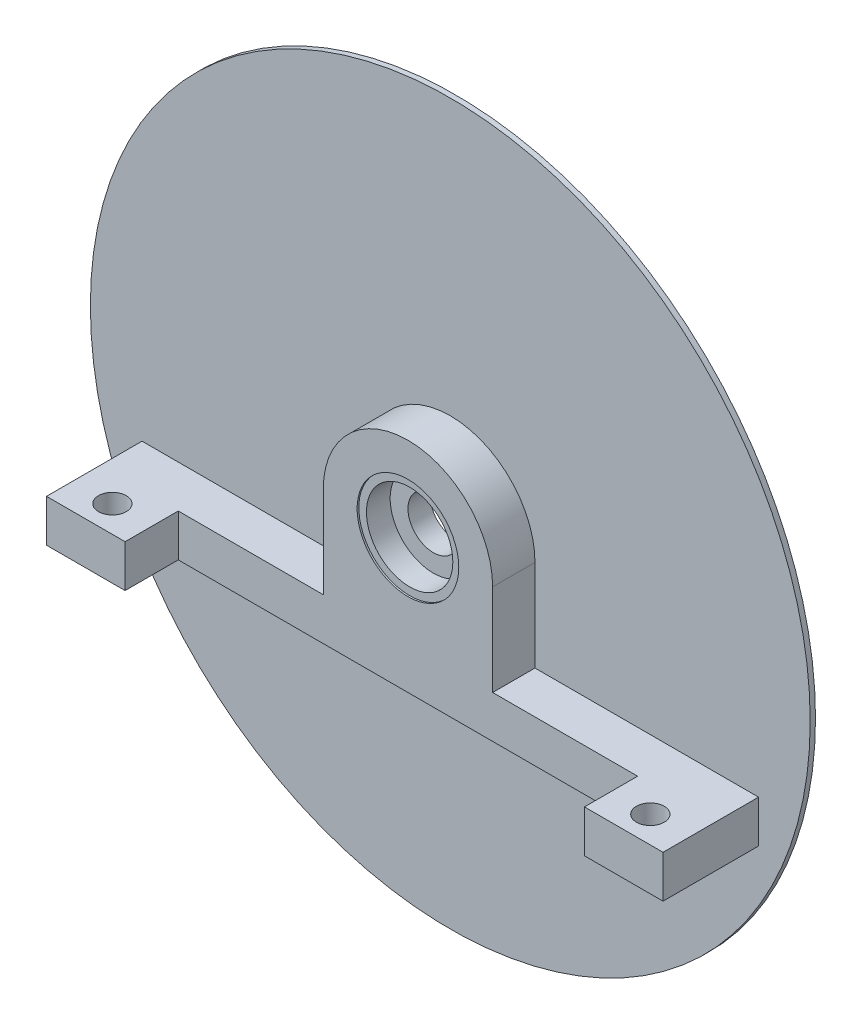
ISO-10303-21;
HEADER;
FILE_DESCRIPTION(('STEP AP214'),'2;1');
FILE_NAME('part.step','',(''),(''),'','','');
FILE_SCHEMA(('AUTOMOTIVE_DESIGN { 1 0 10303 214 1 1 1 1 }'));
ENDSEC;
DATA;
#1=APPLICATION_CONTEXT('core data for automotive mechanical design processes');
#2=APPLICATION_PROTOCOL_DEFINITION('international standard','automotive_design',2000,#1);
#3=PRODUCT_CONTEXT('',#1,'mechanical');
#4=PRODUCT('Part','Part','',(#3));
#5=PRODUCT_RELATED_PRODUCT_CATEGORY('part','',(#4));
#6=PRODUCT_DEFINITION_FORMATION('','',#4);
#7=PRODUCT_DEFINITION_CONTEXT('part definition',#1,'design');
#8=PRODUCT_DEFINITION('design','',#6,#7);
#9=PRODUCT_DEFINITION_SHAPE('','',#8);
#10=(LENGTH_UNIT() NAMED_UNIT(*) SI_UNIT(.MILLI.,.METRE.));
#11=(NAMED_UNIT(*) PLANE_ANGLE_UNIT() SI_UNIT($,.RADIAN.));
#12=(NAMED_UNIT(*) SI_UNIT($,.STERADIAN.) SOLID_ANGLE_UNIT());
#13=UNCERTAINTY_MEASURE_WITH_UNIT(LENGTH_MEASURE(1.E-05),#10,'distance_accuracy_value','');
#14=(GEOMETRIC_REPRESENTATION_CONTEXT(3) GLOBAL_UNCERTAINTY_ASSIGNED_CONTEXT((#13)) GLOBAL_UNIT_ASSIGNED_CONTEXT((#10,
#11,#12)) REPRESENTATION_CONTEXT('',''));
#15=CARTESIAN_POINT('',(0.,0.,0.));
#16=DIRECTION('',(0.,0.,1.));
#17=DIRECTION('',(1.,0.,0.));
#18=AXIS2_PLACEMENT_3D('',#15,#16,#17);
#19=CARTESIAN_POINT('',(0.,0.,-0.635));
#20=DIRECTION('',(0.,0.,1.));
#21=DIRECTION('',(1.,0.,0.));
#22=AXIS2_PLACEMENT_3D('',#19,#20,#21);
#23=CYLINDRICAL_SURFACE('',#22,6.477);
#24=CARTESIAN_POINT('',(0.,0.,-0.635));
#25=DIRECTION('',(0.,0.,1.));
#26=DIRECTION('',(1.,0.,0.));
#27=AXIS2_PLACEMENT_3D('',#24,#25,#26);
#28=CIRCLE('',#27,6.477);
#29=CARTESIAN_POINT('',(6.477,0.,-0.635));
#30=VERTEX_POINT('',#29);
#31=EDGE_CURVE('E146',#30,#30,#28,.T.);
#32=CARTESIAN_POINT('',(0.,0.,2.921));
#33=DIRECTION('',(0.,0.,1.));
#34=DIRECTION('',(1.,0.,0.));
#35=AXIS2_PLACEMENT_3D('',#32,#33,#34);
#36=CIRCLE('',#35,6.477);
#37=CARTESIAN_POINT('',(6.477,0.,2.921));
#38=VERTEX_POINT('',#37);
#39=EDGE_CURVE('E37',#38,#38,#36,.F.);
#40=CARTESIAN_POINT('',(6.477,0.,-0.635));
#41=CARTESIAN_POINT('',(6.477,0.,-0.597958333333333));
#42=CARTESIAN_POINT('',(6.477,0.,-0.560916666666667));
#43=CARTESIAN_POINT('',(6.477,0.,-0.486833333333333));
#44=CARTESIAN_POINT('',(6.477,0.,-0.449791666666666));
#45=CARTESIAN_POINT('',(6.477,0.,-0.375708333333333));
#46=CARTESIAN_POINT('',(6.477,0.,-0.338666666666667));
#47=CARTESIAN_POINT('',(6.477,0.,-0.264583333333333));
#48=CARTESIAN_POINT('',(6.477,0.,-0.227541666666666));
#49=CARTESIAN_POINT('',(6.477,0.,-0.153458333333333));
#50=CARTESIAN_POINT('',(6.477,0.,-0.116416666666666));
#51=CARTESIAN_POINT('',(6.477,0.,-0.0423333333333331));
#52=CARTESIAN_POINT('',(6.477,0.,-0.00529166666666646));
#53=CARTESIAN_POINT('',(6.477,0.,0.0687916666666669));
#54=CARTESIAN_POINT('',(6.477,0.,0.105833333333334));
#55=CARTESIAN_POINT('',(6.477,0.,0.179916666666667));
#56=CARTESIAN_POINT('',(6.477,0.,0.216958333333334));
#57=CARTESIAN_POINT('',(6.477,0.,0.291041666666667));
#58=CARTESIAN_POINT('',(6.477,0.,0.328083333333334));
#59=CARTESIAN_POINT('',(6.477,0.,0.402166666666667));
#60=CARTESIAN_POINT('',(6.477,0.,0.439208333333333));
#61=CARTESIAN_POINT('',(6.477,0.,0.513291666666667));
#62=CARTESIAN_POINT('',(6.477,0.,0.550333333333333));
#63=CARTESIAN_POINT('',(6.477,0.,0.624416666666667));
#64=CARTESIAN_POINT('',(6.477,0.,0.661458333333333));
#65=CARTESIAN_POINT('',(6.477,0.,0.735541666666667));
#66=CARTESIAN_POINT('',(6.477,0.,0.772583333333334));
#67=CARTESIAN_POINT('',(6.477,0.,0.846666666666667));
#68=CARTESIAN_POINT('',(6.477,0.,0.883708333333333));
#69=CARTESIAN_POINT('',(6.477,0.,0.957791666666667));
#70=CARTESIAN_POINT('',(6.477,0.,0.994833333333333));
#71=CARTESIAN_POINT('',(6.477,0.,1.06891666666667));
#72=CARTESIAN_POINT('',(6.477,0.,1.10595833333333));
#73=CARTESIAN_POINT('',(6.477,0.,1.18004166666667));
#74=CARTESIAN_POINT('',(6.477,0.,1.21708333333333));
#75=CARTESIAN_POINT('',(6.477,0.,1.29116666666667));
#76=CARTESIAN_POINT('',(6.477,0.,1.32820833333333));
#77=CARTESIAN_POINT('',(6.477,0.,1.40229166666667));
#78=CARTESIAN_POINT('',(6.477,0.,1.43933333333333));
#79=CARTESIAN_POINT('',(6.477,0.,1.51341666666667));
#80=CARTESIAN_POINT('',(6.477,0.,1.55045833333333));
#81=CARTESIAN_POINT('',(6.477,0.,1.62454166666667));
#82=CARTESIAN_POINT('',(6.477,0.,1.66158333333333));
#83=CARTESIAN_POINT('',(6.477,0.,1.73566666666667));
#84=CARTESIAN_POINT('',(6.477,0.,1.77270833333333));
#85=CARTESIAN_POINT('',(6.477,0.,1.84679166666667));
#86=CARTESIAN_POINT('',(6.477,0.,1.88383333333333));
#87=CARTESIAN_POINT('',(6.477,0.,1.95791666666667));
#88=CARTESIAN_POINT('',(6.477,0.,1.99495833333333));
#89=CARTESIAN_POINT('',(6.477,0.,2.06904166666667));
#90=CARTESIAN_POINT('',(6.477,0.,2.10608333333333));
#91=CARTESIAN_POINT('',(6.477,0.,2.18016666666667));
#92=CARTESIAN_POINT('',(6.477,0.,2.21720833333333));
#93=CARTESIAN_POINT('',(6.477,0.,2.29129166666667));
#94=CARTESIAN_POINT('',(6.477,0.,2.32833333333333));
#95=CARTESIAN_POINT('',(6.477,0.,2.40241666666667));
#96=CARTESIAN_POINT('',(6.477,0.,2.43945833333333));
#97=CARTESIAN_POINT('',(6.477,0.,2.51354166666667));
#98=CARTESIAN_POINT('',(6.477,0.,2.55058333333333));
#99=CARTESIAN_POINT('',(6.477,0.,2.62466666666667));
#100=CARTESIAN_POINT('',(6.477,0.,2.66170833333333));
#101=CARTESIAN_POINT('',(6.477,0.,2.73579166666667));
#102=CARTESIAN_POINT('',(6.477,0.,2.77283333333333));
#103=CARTESIAN_POINT('',(6.477,0.,2.84691666666667));
#104=CARTESIAN_POINT('',(6.477,0.,2.88395833333333));
#105=CARTESIAN_POINT('',(6.477,0.,2.921));
#106=B_SPLINE_CURVE_WITH_KNOTS('',3,(#40,#41,#42,#43,#44,#45,#46,#47,#48,#49,#50,#51,#52,#53,
#54,#55,#56,#57,#58,#59,#60,#61,#62,#63,#64,#65,#66,#67,#68,#69,#70,#71,#72,#73,#74,#75,#76,#77,
#78,#79,#80,#81,#82,#83,#84,#85,#86,#87,#88,#89,#90,#91,#92,#93,#94,#95,#96,#97,#98,#99,#100,
#101,#102,#103,#104,#105),.UNSPECIFIED.,.F.,.F.,(4,2,2,2,2,2,2,2,2,2,2,2,2,2,2,2,2,2,2,2,2,2,2,
2,2,2,2,2,2,2,2,2,4),(0.,0.111125,0.22225,0.333375,0.4445,0.555625,0.66675,0.777875,0.889,
1.000125,1.11125,1.222375,1.3335,1.444625,1.55575,1.666875,1.778,1.889125,2.00025,2.111375,
2.2225,2.333625,2.44475,2.555875,2.667,2.778125,2.88925,3.000375,3.1115,3.222625,3.33375,
3.444875,3.556),.UNSPECIFIED.);
#107=EDGE_CURVE('BSEAM33',#30,#38,#106,.T.);
#108=ORIENTED_EDGE('',*,*,#31,.F.);
#109=ORIENTED_EDGE('',*,*,#39,.F.);
#110=ORIENTED_EDGE('',*,*,#107,.T.);
#111=ORIENTED_EDGE('',*,*,#107,.F.);
#112=EDGE_LOOP('',(#108,#110,#109,#111));
#113=FACE_BOUND('',#112,.T.);
#114=ADVANCED_FACE('F33',(#113),#23,.F.);
#115=CARTESIAN_POINT('',(0.,0.,3.175));
#116=DIRECTION('',(0.,0.,-1.));
#117=DIRECTION('',(-1.,0.,0.));
#118=AXIS2_PLACEMENT_3D('',#115,#116,#117);
#119=CYLINDRICAL_SURFACE('',#118,3.81);
#120=CARTESIAN_POINT('',(0.,0.,-0.635));
#121=DIRECTION('',(0.,0.,1.));
#122=DIRECTION('',(1.,0.,0.));
#123=AXIS2_PLACEMENT_3D('',#120,#121,#122);
#124=CIRCLE('',#123,3.81);
#125=CARTESIAN_POINT('',(3.81,0.,-0.635));
#126=VERTEX_POINT('',#125);
#127=EDGE_CURVE('E143',#126,#126,#124,.T.);
#128=ORIENTED_EDGE('',*,*,#127,.T.);
#129=EDGE_LOOP('',(#128));
#130=FACE_BOUND('',#129,.T.);
#131=CARTESIAN_POINT('',(0.,0.,-3.96875));
#132=DIRECTION('',(0.,0.,-1.));
#133=DIRECTION('',(-1.,0.,0.));
#134=AXIS2_PLACEMENT_3D('',#131,#132,#133);
#135=CIRCLE('',#134,3.81);
#136=CARTESIAN_POINT('',(-3.81,0.,-3.96875));
#137=VERTEX_POINT('',#136);
#138=EDGE_CURVE('E282',#137,#137,#135,.T.);
#139=ORIENTED_EDGE('',*,*,#138,.T.);
#140=EDGE_LOOP('',(#139));
#141=FACE_BOUND('',#140,.T.);
#142=ADVANCED_FACE('F288',(#130,#141),#119,.F.);
#143=CARTESIAN_POINT('',(0.,0.,3.175));
#144=DIRECTION('',(0.,0.,1.));
#145=DIRECTION('',(1.,0.,0.));
#146=AXIS2_PLACEMENT_3D('',#143,#144,#145);
#147=PLANE('',#146);
#148=DIRECTION('',(0.,1.,0.));
#149=VECTOR('',#148,1.);
#150=CARTESIAN_POINT('',(34.4424,-13.716,3.175));
#151=LINE('',#150,#149);
#152=CARTESIAN_POINT('',(34.4424,-20.066,3.175));
#153=VERTEX_POINT('',#152);
#154=CARTESIAN_POINT('',(34.4424,-13.716,3.175));
#155=VERTEX_POINT('',#154);
#156=EDGE_CURVE('E50',#153,#155,#151,.T.);
#157=ORIENTED_EDGE('',*,*,#156,.T.);
#158=DIRECTION('',(-1.,0.,0.));
#159=VECTOR('',#158,1.);
#160=CARTESIAN_POINT('',(12.7,-13.716,3.175));
#161=LINE('',#160,#159);
#162=CARTESIAN_POINT('',(12.7,-13.716,3.175));
#163=VERTEX_POINT('',#162);
#164=EDGE_CURVE('E165',#155,#163,#161,.T.);
#165=ORIENTED_EDGE('',*,*,#164,.T.);
#166=DIRECTION('',(0.,1.,0.));
#167=VECTOR('',#166,1.);
#168=CARTESIAN_POINT('',(12.7,0.,3.175));
#169=LINE('',#168,#167);
#170=CARTESIAN_POINT('',(12.7,0.,3.175));
#171=VERTEX_POINT('',#170);
#172=EDGE_CURVE('E186',#163,#171,#169,.T.);
#173=ORIENTED_EDGE('',*,*,#172,.T.);
#174=CARTESIAN_POINT('',(0.,0.,3.175));
#175=DIRECTION('',(0.,0.,1.));
#176=DIRECTION('',(1.,0.,0.));
#177=AXIS2_PLACEMENT_3D('',#174,#175,#176);
#178=CIRCLE('',#177,12.7);
#179=CARTESIAN_POINT('',(-12.7,0.,3.175));
#180=VERTEX_POINT('',#179);
#181=EDGE_CURVE('E235',#171,#180,#178,.T.);
#182=ORIENTED_EDGE('',*,*,#181,.T.);
#183=DIRECTION('',(0.,-1.,0.));
#184=VECTOR('',#183,1.);
#185=CARTESIAN_POINT('',(-12.7,0.,3.175));
#186=LINE('',#185,#184);
#187=CARTESIAN_POINT('',(-12.7,-13.716,3.175));
#188=VERTEX_POINT('',#187);
#189=EDGE_CURVE('E237',#180,#188,#186,.T.);
#190=ORIENTED_EDGE('',*,*,#189,.T.);
#191=DIRECTION('',(-1.,0.,0.));
#192=VECTOR('',#191,1.);
#193=CARTESIAN_POINT('',(-12.7,-13.716,3.175));
#194=LINE('',#193,#192);
#195=CARTESIAN_POINT('',(-34.4424,-13.716,3.175));
#196=VERTEX_POINT('',#195);
#197=EDGE_CURVE('E238',#188,#196,#194,.T.);
#198=ORIENTED_EDGE('',*,*,#197,.T.);
#199=DIRECTION('',(0.,1.,0.));
#200=VECTOR('',#199,1.);
#201=CARTESIAN_POINT('',(-34.4424,-13.716,3.175));
#202=LINE('',#201,#200);
#203=CARTESIAN_POINT('',(-34.4424,-20.066,3.175));
#204=VERTEX_POINT('',#203);
#205=EDGE_CURVE('E206',#204,#196,#202,.T.);
#206=ORIENTED_EDGE('',*,*,#205,.F.);
#207=DIRECTION('',(1.,0.,0.));
#208=VECTOR('',#207,1.);
#209=CARTESIAN_POINT('',(-46.228,-20.066,3.175));
#210=LINE('',#209,#208);
#211=EDGE_CURVE('E55',#204,#153,#210,.T.);
#212=ORIENTED_EDGE('',*,*,#211,.T.);
#213=EDGE_LOOP('',(#157,#165,#173,#182,#190,#198,#206,#212));
#214=FACE_BOUND('',#213,.T.);
#215=CARTESIAN_POINT('',(0.,0.,3.175));
#216=DIRECTION('',(0.,0.,1.));
#217=DIRECTION('',(1.,0.,0.));
#218=AXIS2_PLACEMENT_3D('',#215,#216,#217);
#219=CIRCLE('',#218,7.62);
#220=CARTESIAN_POINT('',(7.62,0.,3.175));
#221=VERTEX_POINT('',#220);
#222=EDGE_CURVE('E226',#221,#221,#219,.T.);
#223=ORIENTED_EDGE('',*,*,#222,.F.);
#224=EDGE_LOOP('',(#223));
#225=FACE_BOUND('',#224,.T.);
#226=ADVANCED_FACE('F240',(#214,#225),#147,.T.);
#227=CARTESIAN_POINT('',(46.228,-13.716,3.175));
#228=DIRECTION('',(-1.,0.,0.));
#229=DIRECTION('',(0.,0.,1.));
#230=AXIS2_PLACEMENT_3D('',#227,#228,#229);
#231=PLANE('',#230);
#232=DIRECTION('',(0.,1.,0.));
#233=VECTOR('',#232,1.);
#234=CARTESIAN_POINT('',(46.228,-13.716,-3.175));
#235=LINE('',#234,#233);
#236=CARTESIAN_POINT('',(46.228,-20.066,-3.175));
#237=VERTEX_POINT('',#236);
#238=CARTESIAN_POINT('',(46.228,-13.716,-3.175));
#239=VERTEX_POINT('',#238);
#240=EDGE_CURVE('E126',#237,#239,#235,.T.);
#241=ORIENTED_EDGE('',*,*,#240,.T.);
#242=DIRECTION('',(0.,0.,-1.));
#243=VECTOR('',#242,1.);
#244=CARTESIAN_POINT('',(46.228,-13.716,3.175));
#245=LINE('',#244,#243);
#246=CARTESIAN_POINT('',(46.228,-13.716,11.1506));
#247=VERTEX_POINT('',#246);
#248=EDGE_CURVE('E11',#247,#239,#245,.T.);
#249=ORIENTED_EDGE('',*,*,#248,.F.);
#250=DIRECTION('',(0.,-1.,0.));
#251=VECTOR('',#250,1.);
#252=CARTESIAN_POINT('',(46.228,-13.716,11.1506));
#253=LINE('',#252,#251);
#254=CARTESIAN_POINT('',(46.228,-20.066,11.1506));
#255=VERTEX_POINT('',#254);
#256=EDGE_CURVE('E266',#247,#255,#253,.T.);
#257=ORIENTED_EDGE('',*,*,#256,.T.);
#258=DIRECTION('',(0.,0.,-1.));
#259=VECTOR('',#258,1.);
#260=CARTESIAN_POINT('',(46.228,-20.066,3.175));
#261=LINE('',#260,#259);
#262=EDGE_CURVE('E142',#255,#237,#261,.T.);
#263=ORIENTED_EDGE('',*,*,#262,.T.);
#264=EDGE_LOOP('',(#241,#249,#257,#263));
#265=FACE_BOUND('',#264,.T.);
#266=ADVANCED_FACE('F35',(#265),#231,.F.);
#267=CARTESIAN_POINT('',(12.7,-13.716,3.175));
#268=DIRECTION('',(0.,-1.,0.));
#269=DIRECTION('',(1.,0.,0.));
#270=AXIS2_PLACEMENT_3D('',#267,#268,#269);
#271=PLANE('',#270);
#272=CARTESIAN_POINT('',(40.3352,-13.716,7.1628));
#273=DIRECTION('',(0.,-1.,0.));
#274=DIRECTION('',(1.,0.,0.));
#275=AXIS2_PLACEMENT_3D('',#272,#273,#274);
#276=CIRCLE('',#275,2.0828);
#277=CARTESIAN_POINT('',(42.418,-13.716,7.1628));
#278=VERTEX_POINT('',#277);
#279=EDGE_CURVE('E271',#278,#278,#276,.T.);
#280=ORIENTED_EDGE('',*,*,#279,.T.);
#281=EDGE_LOOP('',(#280));
#282=FACE_BOUND('',#281,.T.);
#283=DIRECTION('',(-1.,0.,0.));
#284=VECTOR('',#283,1.);
#285=CARTESIAN_POINT('',(12.7,-13.716,-3.175));
#286=LINE('',#285,#284);
#287=CARTESIAN_POINT('',(12.7,-13.716,-3.175));
#288=VERTEX_POINT('',#287);
#289=EDGE_CURVE('E122',#239,#288,#286,.T.);
#290=ORIENTED_EDGE('',*,*,#289,.T.);
#291=DIRECTION('',(0.,0.,-1.));
#292=VECTOR('',#291,1.);
#293=CARTESIAN_POINT('',(12.7,-13.716,3.175));
#294=LINE('',#293,#292);
#295=EDGE_CURVE('E42',#163,#288,#294,.T.);
#296=ORIENTED_EDGE('',*,*,#295,.F.);
#297=ORIENTED_EDGE('',*,*,#164,.F.);
#298=DIRECTION('',(0.,0.,-1.));
#299=VECTOR('',#298,1.);
#300=CARTESIAN_POINT('',(34.4424,-13.716,11.1506));
#301=LINE('',#300,#299);
#302=CARTESIAN_POINT('',(34.4424,-13.716,11.1506));
#303=VERTEX_POINT('',#302);
#304=EDGE_CURVE('E188',#303,#155,#301,.T.);
#305=ORIENTED_EDGE('',*,*,#304,.F.);
#306=DIRECTION('',(1.,0.,0.));
#307=VECTOR('',#306,1.);
#308=CARTESIAN_POINT('',(46.228,-13.716,11.1506));
#309=LINE('',#308,#307);
#310=EDGE_CURVE('E137',#303,#247,#309,.T.);
#311=ORIENTED_EDGE('',*,*,#310,.T.);
#312=ORIENTED_EDGE('',*,*,#248,.T.);
#313=EDGE_LOOP('',(#290,#296,#297,#305,#311,#312));
#314=FACE_BOUND('',#313,.T.);
#315=ADVANCED_FACE('F135',(#282,#314),#271,.F.);
#316=CARTESIAN_POINT('',(12.7,0.,3.175));
#317=DIRECTION('',(-1.,0.,0.));
#318=DIRECTION('',(0.,-1.,0.));
#319=AXIS2_PLACEMENT_3D('',#316,#317,#318);
#320=PLANE('',#319);
#321=DIRECTION('',(0.,1.,0.));
#322=VECTOR('',#321,1.);
#323=CARTESIAN_POINT('',(12.7,0.,-3.175));
#324=LINE('',#323,#322);
#325=CARTESIAN_POINT('',(12.7,0.,-3.175));
#326=VERTEX_POINT('',#325);
#327=EDGE_CURVE('E129',#288,#326,#324,.T.);
#328=ORIENTED_EDGE('',*,*,#327,.T.);
#329=DIRECTION('',(0.,0.,-1.));
#330=VECTOR('',#329,1.);
#331=CARTESIAN_POINT('',(12.7,0.,3.175));
#332=LINE('',#331,#330);
#333=EDGE_CURVE('E179',#171,#326,#332,.T.);
#334=ORIENTED_EDGE('',*,*,#333,.F.);
#335=ORIENTED_EDGE('',*,*,#172,.F.);
#336=ORIENTED_EDGE('',*,*,#295,.T.);
#337=EDGE_LOOP('',(#328,#334,#335,#336));
#338=FACE_BOUND('',#337,.T.);
#339=ADVANCED_FACE('F184',(#338),#320,.F.);
#340=CARTESIAN_POINT('',(0.,0.,3.175));
#341=DIRECTION('',(0.,0.,-1.));
#342=DIRECTION('',(-1.,0.,0.));
#343=AXIS2_PLACEMENT_3D('',#340,#341,#342);
#344=CYLINDRICAL_SURFACE('',#343,12.7);
#345=CARTESIAN_POINT('',(0.,0.,-3.175));
#346=DIRECTION('',(0.,0.,1.));
#347=DIRECTION('',(1.,0.,0.));
#348=AXIS2_PLACEMENT_3D('',#345,#346,#347);
#349=CIRCLE('',#348,12.7);
#350=CARTESIAN_POINT('',(-12.7,0.,-3.175));
#351=VERTEX_POINT('',#350);
#352=EDGE_CURVE('E151',#326,#351,#349,.T.);
#353=ORIENTED_EDGE('',*,*,#352,.T.);
#354=DIRECTION('',(0.,0.,-1.));
#355=VECTOR('',#354,1.);
#356=CARTESIAN_POINT('',(-12.7,0.,3.175));
#357=LINE('',#356,#355);
#358=EDGE_CURVE('E176',#180,#351,#357,.T.);
#359=ORIENTED_EDGE('',*,*,#358,.F.);
#360=ORIENTED_EDGE('',*,*,#181,.F.);
#361=ORIENTED_EDGE('',*,*,#333,.T.);
#362=EDGE_LOOP('',(#353,#359,#360,#361));
#363=FACE_BOUND('',#362,.T.);
#364=ADVANCED_FACE('F329',(#363),#344,.T.);
#365=CARTESIAN_POINT('',(-12.7,0.,3.175));
#366=DIRECTION('',(1.,0.,0.));
#367=DIRECTION('',(0.,1.,0.));
#368=AXIS2_PLACEMENT_3D('',#365,#366,#367);
#369=PLANE('',#368);
#370=DIRECTION('',(0.,-1.,0.));
#371=VECTOR('',#370,1.);
#372=CARTESIAN_POINT('',(-12.7,0.,-3.175));
#373=LINE('',#372,#371);
#374=CARTESIAN_POINT('',(-12.7,-13.716,-3.175));
#375=VERTEX_POINT('',#374);
#376=EDGE_CURVE('E154',#351,#375,#373,.T.);
#377=ORIENTED_EDGE('',*,*,#376,.T.);
#378=DIRECTION('',(0.,0.,-1.));
#379=VECTOR('',#378,1.);
#380=CARTESIAN_POINT('',(-12.7,-13.716,3.175));
#381=LINE('',#380,#379);
#382=EDGE_CURVE('E173',#188,#375,#381,.T.);
#383=ORIENTED_EDGE('',*,*,#382,.F.);
#384=ORIENTED_EDGE('',*,*,#189,.F.);
#385=ORIENTED_EDGE('',*,*,#358,.T.);
#386=EDGE_LOOP('',(#377,#383,#384,#385));
#387=FACE_BOUND('',#386,.T.);
#388=ADVANCED_FACE('F325',(#387),#369,.F.);
#389=CARTESIAN_POINT('',(-12.7,-13.716,3.175));
#390=DIRECTION('',(0.,-1.,0.));
#391=DIRECTION('',(1.,0.,0.));
#392=AXIS2_PLACEMENT_3D('',#389,#390,#391);
#393=PLANE('',#392);
#394=CARTESIAN_POINT('',(-40.3352,-13.716,7.1628));
#395=DIRECTION('',(0.,1.,0.));
#396=DIRECTION('',(-1.,0.,0.));
#397=AXIS2_PLACEMENT_3D('',#394,#395,#396);
#398=CIRCLE('',#397,2.0828);
#399=CARTESIAN_POINT('',(-42.418,-13.716,7.1628));
#400=VERTEX_POINT('',#399);
#401=EDGE_CURVE('E195',#400,#400,#398,.T.);
#402=ORIENTED_EDGE('',*,*,#401,.F.);
#403=EDGE_LOOP('',(#402));
#404=FACE_BOUND('',#403,.T.);
#405=DIRECTION('',(-1.,0.,0.));
#406=VECTOR('',#405,1.);
#407=CARTESIAN_POINT('',(-12.7,-13.716,-3.175));
#408=LINE('',#407,#406);
#409=CARTESIAN_POINT('',(-46.228,-13.716,-3.175));
#410=VERTEX_POINT('',#409);
#411=EDGE_CURVE('E157',#375,#410,#408,.T.);
#412=ORIENTED_EDGE('',*,*,#411,.T.);
#413=DIRECTION('',(0.,0.,-1.));
#414=VECTOR('',#413,1.);
#415=CARTESIAN_POINT('',(-46.228,-13.716,3.175));
#416=LINE('',#415,#414);
#417=CARTESIAN_POINT('',(-46.228,-13.716,11.1506));
#418=VERTEX_POINT('',#417);
#419=EDGE_CURVE('E170',#418,#410,#416,.T.);
#420=ORIENTED_EDGE('',*,*,#419,.F.);
#421=DIRECTION('',(-1.,0.,0.));
#422=VECTOR('',#421,1.);
#423=CARTESIAN_POINT('',(-46.228,-13.716,11.1506));
#424=LINE('',#423,#422);
#425=CARTESIAN_POINT('',(-34.4424,-13.716,11.1506));
#426=VERTEX_POINT('',#425);
#427=EDGE_CURVE('E215',#426,#418,#424,.T.);
#428=ORIENTED_EDGE('',*,*,#427,.F.);
#429=DIRECTION('',(0.,0.,-1.));
#430=VECTOR('',#429,1.);
#431=CARTESIAN_POINT('',(-34.4424,-13.716,11.1506));
#432=LINE('',#431,#430);
#433=EDGE_CURVE('E218',#426,#196,#432,.T.);
#434=ORIENTED_EDGE('',*,*,#433,.T.);
#435=ORIENTED_EDGE('',*,*,#197,.F.);
#436=ORIENTED_EDGE('',*,*,#382,.T.);
#437=EDGE_LOOP('',(#412,#420,#428,#434,#435,#436));
#438=FACE_BOUND('',#437,.T.);
#439=ADVANCED_FACE('F251',(#404,#438),#393,.F.);
#440=CARTESIAN_POINT('',(-46.228,-13.716,3.175));
#441=DIRECTION('',(1.,0.,0.));
#442=DIRECTION('',(0.,0.,-1.));
#443=AXIS2_PLACEMENT_3D('',#440,#441,#442);
#444=PLANE('',#443);
#445=DIRECTION('',(0.,-1.,0.));
#446=VECTOR('',#445,1.);
#447=CARTESIAN_POINT('',(-46.228,-13.716,-3.175));
#448=LINE('',#447,#446);
#449=CARTESIAN_POINT('',(-46.228,-20.066,-3.175));
#450=VERTEX_POINT('',#449);
#451=EDGE_CURVE('E160',#410,#450,#448,.T.);
#452=ORIENTED_EDGE('',*,*,#451,.T.);
#453=DIRECTION('',(0.,0.,-1.));
#454=VECTOR('',#453,1.);
#455=CARTESIAN_POINT('',(-46.228,-20.066,3.175));
#456=LINE('',#455,#454);
#457=CARTESIAN_POINT('',(-46.228,-20.066,11.1506));
#458=VERTEX_POINT('',#457);
#459=EDGE_CURVE('E167',#458,#450,#456,.T.);
#460=ORIENTED_EDGE('',*,*,#459,.F.);
#461=DIRECTION('',(0.,-1.,0.));
#462=VECTOR('',#461,1.);
#463=CARTESIAN_POINT('',(-46.228,-13.716,11.1506));
#464=LINE('',#463,#462);
#465=EDGE_CURVE('E208',#418,#458,#464,.T.);
#466=ORIENTED_EDGE('',*,*,#465,.F.);
#467=ORIENTED_EDGE('',*,*,#419,.T.);
#468=EDGE_LOOP('',(#452,#460,#466,#467));
#469=FACE_BOUND('',#468,.T.);
#470=ADVANCED_FACE('F256',(#469),#444,.F.);
#471=CARTESIAN_POINT('',(-46.228,-20.066,3.175));
#472=DIRECTION('',(0.,1.,0.));
#473=DIRECTION('',(0.,0.,1.));
#474=AXIS2_PLACEMENT_3D('',#471,#472,#473);
#475=PLANE('',#474);
#476=CARTESIAN_POINT('',(40.3352,-20.066,7.1628));
#477=DIRECTION('',(0.,-1.,0.));
#478=DIRECTION('',(1.,0.,0.));
#479=AXIS2_PLACEMENT_3D('',#476,#477,#478);
#480=CIRCLE('',#479,2.0828);
#481=CARTESIAN_POINT('',(42.418,-20.066,7.1628));
#482=VERTEX_POINT('',#481);
#483=EDGE_CURVE('E269',#482,#482,#480,.T.);
#484=ORIENTED_EDGE('',*,*,#483,.F.);
#485=EDGE_LOOP('',(#484));
#486=FACE_BOUND('',#485,.T.);
#487=CARTESIAN_POINT('',(-40.3352,-20.066,7.1628));
#488=DIRECTION('',(0.,1.,0.));
#489=DIRECTION('',(-1.,0.,0.));
#490=AXIS2_PLACEMENT_3D('',#487,#488,#489);
#491=CIRCLE('',#490,2.0828);
#492=CARTESIAN_POINT('',(-42.418,-20.066,7.1628));
#493=VERTEX_POINT('',#492);
#494=EDGE_CURVE('E199',#493,#493,#491,.T.);
#495=ORIENTED_EDGE('',*,*,#494,.T.);
#496=EDGE_LOOP('',(#495));
#497=FACE_BOUND('',#496,.T.);
#498=DIRECTION('',(1.,0.,0.));
#499=VECTOR('',#498,1.);
#500=CARTESIAN_POINT('',(-46.228,-20.066,-3.175));
#501=LINE('',#500,#499);
#502=EDGE_CURVE('E163',#450,#237,#501,.T.);
#503=ORIENTED_EDGE('',*,*,#502,.T.);
#504=ORIENTED_EDGE('',*,*,#262,.F.);
#505=DIRECTION('',(-1.,0.,0.));
#506=VECTOR('',#505,1.);
#507=CARTESIAN_POINT('',(46.228,-20.066,11.1506));
#508=LINE('',#507,#506);
#509=CARTESIAN_POINT('',(34.4424,-20.066,11.1506));
#510=VERTEX_POINT('',#509);
#511=EDGE_CURVE('E201',#255,#510,#508,.T.);
#512=ORIENTED_EDGE('',*,*,#511,.T.);
#513=DIRECTION('',(0.,0.,-1.));
#514=VECTOR('',#513,1.);
#515=CARTESIAN_POINT('',(34.4424,-20.066,11.1506));
#516=LINE('',#515,#514);
#517=EDGE_CURVE('E196',#510,#153,#516,.T.);
#518=ORIENTED_EDGE('',*,*,#517,.T.);
#519=ORIENTED_EDGE('',*,*,#211,.F.);
#520=DIRECTION('',(0.,0.,-1.));
#521=VECTOR('',#520,1.);
#522=CARTESIAN_POINT('',(-34.4424,-20.066,11.1506));
#523=LINE('',#522,#521);
#524=CARTESIAN_POINT('',(-34.4424,-20.066,11.1506));
#525=VERTEX_POINT('',#524);
#526=EDGE_CURVE('E223',#525,#204,#523,.T.);
#527=ORIENTED_EDGE('',*,*,#526,.F.);
#528=DIRECTION('',(1.,0.,0.));
#529=VECTOR('',#528,1.);
#530=CARTESIAN_POINT('',(-46.228,-20.066,11.1506));
#531=LINE('',#530,#529);
#532=EDGE_CURVE('E211',#458,#525,#531,.T.);
#533=ORIENTED_EDGE('',*,*,#532,.F.);
#534=ORIENTED_EDGE('',*,*,#459,.T.);
#535=EDGE_LOOP('',(#503,#504,#512,#518,#519,#527,#533,#534));
#536=FACE_BOUND('',#535,.T.);
#537=ADVANCED_FACE('F259',(#486,#497,#536),#475,.F.);
#538=CARTESIAN_POINT('',(0.,0.,-0.635));
#539=DIRECTION('',(0.,0.,1.));
#540=DIRECTION('',(1.,0.,0.));
#541=AXIS2_PLACEMENT_3D('',#538,#539,#540);
#542=PLANE('',#541);
#543=ORIENTED_EDGE('',*,*,#127,.F.);
#544=EDGE_LOOP('',(#543));
#545=FACE_BOUND('',#544,.T.);
#546=ORIENTED_EDGE('',*,*,#31,.T.);
#547=EDGE_LOOP('',(#546));
#548=FACE_BOUND('',#547,.T.);
#549=ADVANCED_FACE('F313',(#545,#548),#542,.T.);
#550=CARTESIAN_POINT('',(0.,0.,2.921));
#551=DIRECTION('',(0.,0.,1.));
#552=DIRECTION('',(1.,0.,0.));
#553=AXIS2_PLACEMENT_3D('',#550,#551,#552);
#554=PLANE('',#553);
#555=CARTESIAN_POINT('',(0.,0.,2.921));
#556=DIRECTION('',(0.,0.,1.));
#557=DIRECTION('',(1.,0.,0.));
#558=AXIS2_PLACEMENT_3D('',#555,#556,#557);
#559=CIRCLE('',#558,7.62);
#560=CARTESIAN_POINT('',(7.62,0.,2.921));
#561=VERTEX_POINT('',#560);
#562=EDGE_CURVE('E227',#561,#561,#559,.T.);
#563=ORIENTED_EDGE('',*,*,#562,.T.);
#564=EDGE_LOOP('',(#563));
#565=FACE_BOUND('',#564,.T.);
#566=ORIENTED_EDGE('',*,*,#39,.T.);
#567=EDGE_LOOP('',(#566));
#568=FACE_BOUND('',#567,.T.);
#569=ADVANCED_FACE('F406',(#565,#568),#554,.T.);
#570=CARTESIAN_POINT('',(0.,0.,2.921));
#571=DIRECTION('',(0.,0.,1.));
#572=DIRECTION('',(1.,0.,0.));
#573=AXIS2_PLACEMENT_3D('',#570,#571,#572);
#574=CYLINDRICAL_SURFACE('',#573,7.62);
#575=ORIENTED_EDGE('',*,*,#562,.F.);
#576=EDGE_LOOP('',(#575));
#577=FACE_BOUND('',#576,.T.);
#578=ORIENTED_EDGE('',*,*,#222,.T.);
#579=EDGE_LOOP('',(#578));
#580=FACE_BOUND('',#579,.T.);
#581=ADVANCED_FACE('F399',(#577,#580),#574,.F.);
#582=CARTESIAN_POINT('',(-34.4424,-13.716,11.1506));
#583=DIRECTION('',(-1.,0.,0.));
#584=DIRECTION('',(0.,0.,1.));
#585=AXIS2_PLACEMENT_3D('',#582,#583,#584);
#586=PLANE('',#585);
#587=ORIENTED_EDGE('',*,*,#205,.T.);
#588=ORIENTED_EDGE('',*,*,#433,.F.);
#589=DIRECTION('',(0.,1.,0.));
#590=VECTOR('',#589,1.);
#591=CARTESIAN_POINT('',(-34.4424,-13.716,11.1506));
#592=LINE('',#591,#590);
#593=EDGE_CURVE('E213',#525,#426,#592,.T.);
#594=ORIENTED_EDGE('',*,*,#593,.F.);
#595=ORIENTED_EDGE('',*,*,#526,.T.);
#596=EDGE_LOOP('',(#587,#588,#594,#595));
#597=FACE_BOUND('',#596,.T.);
#598=ADVANCED_FACE('F247',(#597),#586,.F.);
#599=CARTESIAN_POINT('',(0.,0.,11.1506));
#600=DIRECTION('',(0.,0.,1.));
#601=DIRECTION('',(1.,0.,0.));
#602=AXIS2_PLACEMENT_3D('',#599,#600,#601);
#603=PLANE('',#602);
#604=ORIENTED_EDGE('',*,*,#465,.T.);
#605=ORIENTED_EDGE('',*,*,#532,.T.);
#606=ORIENTED_EDGE('',*,*,#593,.T.);
#607=ORIENTED_EDGE('',*,*,#427,.T.);
#608=EDGE_LOOP('',(#604,#605,#606,#607));
#609=FACE_BOUND('',#608,.T.);
#610=ADVANCED_FACE('F254',(#609),#603,.T.);
#611=CARTESIAN_POINT('',(-40.3352,-20.066,7.1628));
#612=DIRECTION('',(0.,1.,0.));
#613=DIRECTION('',(-1.,0.,0.));
#614=AXIS2_PLACEMENT_3D('',#611,#612,#613);
#615=CYLINDRICAL_SURFACE('',#614,2.0828);
#616=ORIENTED_EDGE('',*,*,#494,.F.);
#617=EDGE_LOOP('',(#616));
#618=FACE_BOUND('',#617,.T.);
#619=ORIENTED_EDGE('',*,*,#401,.T.);
#620=EDGE_LOOP('',(#619));
#621=FACE_BOUND('',#620,.T.);
#622=ADVANCED_FACE('F377',(#618,#621),#615,.F.);
#623=CARTESIAN_POINT('',(34.4424,-13.716,11.1506));
#624=DIRECTION('',(-1.,0.,0.));
#625=DIRECTION('',(0.,0.,1.));
#626=AXIS2_PLACEMENT_3D('',#623,#624,#625);
#627=PLANE('',#626);
#628=ORIENTED_EDGE('',*,*,#156,.F.);
#629=ORIENTED_EDGE('',*,*,#517,.F.);
#630=DIRECTION('',(0.,1.,0.));
#631=VECTOR('',#630,1.);
#632=CARTESIAN_POINT('',(34.4424,-13.716,11.1506));
#633=LINE('',#632,#631);
#634=EDGE_CURVE('E194',#510,#303,#633,.T.);
#635=ORIENTED_EDGE('',*,*,#634,.T.);
#636=ORIENTED_EDGE('',*,*,#304,.T.);
#637=EDGE_LOOP('',(#628,#629,#635,#636));
#638=FACE_BOUND('',#637,.T.);
#639=ADVANCED_FACE('F192',(#638),#627,.T.);
#640=CARTESIAN_POINT('',(0.,0.,11.1506));
#641=DIRECTION('',(0.,0.,1.));
#642=DIRECTION('',(-1.,0.,0.));
#643=AXIS2_PLACEMENT_3D('',#640,#641,#642);
#644=PLANE('',#643);
#645=ORIENTED_EDGE('',*,*,#256,.F.);
#646=ORIENTED_EDGE('',*,*,#310,.F.);
#647=ORIENTED_EDGE('',*,*,#634,.F.);
#648=ORIENTED_EDGE('',*,*,#511,.F.);
#649=EDGE_LOOP('',(#645,#646,#647,#648));
#650=FACE_BOUND('',#649,.T.);
#651=ADVANCED_FACE('F263',(#650),#644,.T.);
#652=CARTESIAN_POINT('',(40.3352,-20.066,7.1628));
#653=DIRECTION('',(0.,1.,0.));
#654=DIRECTION('',(-1.,0.,0.));
#655=AXIS2_PLACEMENT_3D('',#652,#653,#654);
#656=CYLINDRICAL_SURFACE('',#655,2.0828);
#657=ORIENTED_EDGE('',*,*,#483,.T.);
#658=EDGE_LOOP('',(#657));
#659=FACE_BOUND('',#658,.T.);
#660=ORIENTED_EDGE('',*,*,#279,.F.);
#661=EDGE_LOOP('',(#660));
#662=FACE_BOUND('',#661,.T.);
#663=ADVANCED_FACE('F292',(#659,#662),#656,.F.);
#664=CARTESIAN_POINT('',(0.,0.,-3.96875));
#665=DIRECTION('',(0.,0.,-1.));
#666=DIRECTION('',(-1.,0.,0.));
#667=AXIS2_PLACEMENT_3D('',#664,#665,#666);
#668=PLANE('',#667);
#669=CARTESIAN_POINT('',(0.,0.,-3.96875));
#670=DIRECTION('',(0.,0.,-1.));
#671=DIRECTION('',(-1.,0.,0.));
#672=AXIS2_PLACEMENT_3D('',#669,#670,#671);
#673=CIRCLE('',#672,53.975);
#674=CARTESIAN_POINT('',(-53.975,0.,-3.96875));
#675=VERTEX_POINT('',#674);
#676=EDGE_CURVE('E276',#675,#675,#673,.T.);
#677=ORIENTED_EDGE('',*,*,#676,.T.);
#678=EDGE_LOOP('',(#677));
#679=FACE_BOUND('',#678,.T.);
#680=ORIENTED_EDGE('',*,*,#138,.F.);
#681=EDGE_LOOP('',(#680));
#682=FACE_BOUND('',#681,.T.);
#683=ADVANCED_FACE('F290',(#679,#682),#668,.T.);
#684=CARTESIAN_POINT('',(0.,0.,-3.175));
#685=DIRECTION('',(0.,0.,-1.));
#686=DIRECTION('',(-1.,0.,0.));
#687=AXIS2_PLACEMENT_3D('',#684,#685,#686);
#688=PLANE('',#687);
#689=ORIENTED_EDGE('',*,*,#240,.F.);
#690=ORIENTED_EDGE('',*,*,#502,.F.);
#691=ORIENTED_EDGE('',*,*,#451,.F.);
#692=ORIENTED_EDGE('',*,*,#411,.F.);
#693=ORIENTED_EDGE('',*,*,#376,.F.);
#694=ORIENTED_EDGE('',*,*,#352,.F.);
#695=ORIENTED_EDGE('',*,*,#327,.F.);
#696=ORIENTED_EDGE('',*,*,#289,.F.);
#697=EDGE_LOOP('',(#689,#690,#691,#692,#693,#694,#695,#696));
#698=FACE_BOUND('',#697,.T.);
#699=CARTESIAN_POINT('',(0.,0.,-3.175));
#700=DIRECTION('',(0.,0.,-1.));
#701=DIRECTION('',(-1.,0.,0.));
#702=AXIS2_PLACEMENT_3D('',#699,#700,#701);
#703=CIRCLE('',#702,53.975);
#704=CARTESIAN_POINT('',(-53.975,0.,-3.175));
#705=VERTEX_POINT('',#704);
#706=EDGE_CURVE('E279',#705,#705,#703,.T.);
#707=ORIENTED_EDGE('',*,*,#706,.F.);
#708=EDGE_LOOP('',(#707));
#709=FACE_BOUND('',#708,.T.);
#710=ADVANCED_FACE('F123',(#698,#709),#688,.F.);
#711=CARTESIAN_POINT('',(0.,0.,-3.96875));
#712=DIRECTION('',(0.,0.,1.));
#713=DIRECTION('',(1.,0.,0.));
#714=AXIS2_PLACEMENT_3D('',#711,#712,#713);
#715=CYLINDRICAL_SURFACE('',#714,53.975);
#716=ORIENTED_EDGE('',*,*,#676,.F.);
#717=EDGE_LOOP('',(#716));
#718=FACE_BOUND('',#717,.T.);
#719=ORIENTED_EDGE('',*,*,#706,.T.);
#720=EDGE_LOOP('',(#719));
#721=FACE_BOUND('',#720,.T.);
#722=ADVANCED_FACE('F299',(#718,#721),#715,.T.);
#723=CLOSED_SHELL('',(#114,#142,#226,#266,#315,#339,#364,#388,#439,#470,#537,#549,#569,#581,
#598,#610,#622,#639,#651,#663,#683,#710,#722));
#724=MANIFOLD_SOLID_BREP('B2',#723);
#725=ADVANCED_BREP_SHAPE_REPRESENTATION('',(#18,#724),#14);
#726=SHAPE_DEFINITION_REPRESENTATION(#9,#725);
ENDSEC;
END-ISO-10303-21;
